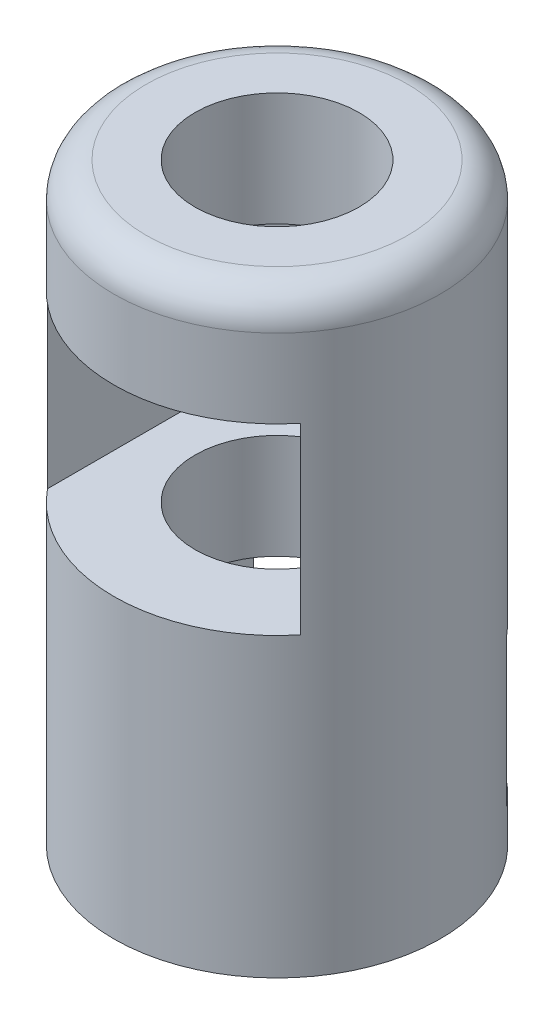
ISO-10303-21;
HEADER;
FILE_DESCRIPTION(('STEP AP214'),'2;1');
FILE_NAME('part.step','',(''),(''),'','','');
FILE_SCHEMA(('AUTOMOTIVE_DESIGN { 1 0 10303 214 1 1 1 1 }'));
ENDSEC;
DATA;
#1=APPLICATION_CONTEXT('core data for automotive mechanical design processes');
#2=APPLICATION_PROTOCOL_DEFINITION('international standard','automotive_design',2000,#1);
#3=PRODUCT_CONTEXT('',#1,'mechanical');
#4=PRODUCT('Part','Part','',(#3));
#5=PRODUCT_RELATED_PRODUCT_CATEGORY('part','',(#4));
#6=PRODUCT_DEFINITION_FORMATION('','',#4);
#7=PRODUCT_DEFINITION_CONTEXT('part definition',#1,'design');
#8=PRODUCT_DEFINITION('design','',#6,#7);
#9=PRODUCT_DEFINITION_SHAPE('','',#8);
#10=(LENGTH_UNIT() NAMED_UNIT(*) SI_UNIT(.MILLI.,.METRE.));
#11=(NAMED_UNIT(*) PLANE_ANGLE_UNIT() SI_UNIT($,.RADIAN.));
#12=(NAMED_UNIT(*) SI_UNIT($,.STERADIAN.) SOLID_ANGLE_UNIT());
#13=UNCERTAINTY_MEASURE_WITH_UNIT(LENGTH_MEASURE(1.E-05),#10,'distance_accuracy_value','');
#14=(GEOMETRIC_REPRESENTATION_CONTEXT(3) GLOBAL_UNCERTAINTY_ASSIGNED_CONTEXT((#13)) GLOBAL_UNIT_ASSIGNED_CONTEXT((#10,
#11,#12)) REPRESENTATION_CONTEXT('',''));
#15=CARTESIAN_POINT('',(0.,0.,0.));
#16=DIRECTION('',(0.,0.,1.));
#17=DIRECTION('',(1.,0.,0.));
#18=AXIS2_PLACEMENT_3D('',#15,#16,#17);
#19=CARTESIAN_POINT('',(0.,40.,0.));
#20=DIRECTION('',(0.,-1.,0.));
#21=DIRECTION('',(0.,0.,-1.));
#22=AXIS2_PLACEMENT_3D('',#19,#20,#21);
#23=CYLINDRICAL_SURFACE('',#22,4.7);
#24=CARTESIAN_POINT('',(0.,11.,0.));
#25=DIRECTION('',(0.,1.,0.));
#26=DIRECTION('',(0.,0.,1.));
#27=AXIS2_PLACEMENT_3D('',#24,#25,#26);
#28=CIRCLE('',#27,4.7);
#29=CARTESIAN_POINT('',(0.,11.,4.7));
#30=VERTEX_POINT('',#29);
#31=EDGE_CURVE('E191',#30,#30,#28,.F.);
#32=ORIENTED_EDGE('',*,*,#31,.T.);
#33=EDGE_LOOP('',(#32));
#34=FACE_BOUND('',#33,.T.);
#35=CARTESIAN_POINT('',(0.,17.,0.));
#36=DIRECTION('',(0.,1.,0.));
#37=DIRECTION('',(0.,0.,1.));
#38=AXIS2_PLACEMENT_3D('',#35,#36,#37);
#39=CIRCLE('',#38,4.7);
#40=CARTESIAN_POINT('',(0.,17.,4.7));
#41=VERTEX_POINT('',#40);
#42=EDGE_CURVE('E122',#41,#41,#39,.F.);
#43=ORIENTED_EDGE('',*,*,#42,.F.);
#44=EDGE_LOOP('',(#43));
#45=FACE_BOUND('',#44,.T.);
#46=ADVANCED_FACE('F34',(#34,#45),#23,.F.);
#47=CARTESIAN_POINT('',(0.,0.,0.));
#48=DIRECTION('',(0.,-1.,0.));
#49=DIRECTION('',(0.,0.,-1.));
#50=AXIS2_PLACEMENT_3D('',#47,#48,#49);
#51=CIRCLE('',#50,4.7);
#52=CARTESIAN_POINT('',(0.,0.,-4.7));
#53=VERTEX_POINT('',#52);
#54=EDGE_CURVE('E195',#53,#53,#51,.T.);
#55=ORIENTED_EDGE('',*,*,#54,.T.);
#56=EDGE_LOOP('',(#55));
#57=FACE_BOUND('',#56,.T.);
#58=CARTESIAN_POINT('',(0.,2.5,0.));
#59=DIRECTION('',(0.,1.,0.));
#60=DIRECTION('',(0.,0.,1.));
#61=AXIS2_PLACEMENT_3D('',#58,#59,#60);
#62=CIRCLE('',#61,4.7);
#63=CARTESIAN_POINT('',(0.,2.5,4.7));
#64=VERTEX_POINT('',#63);
#65=EDGE_CURVE('E199',#64,#64,#62,.F.);
#66=ORIENTED_EDGE('',*,*,#65,.F.);
#67=EDGE_LOOP('',(#66));
#68=FACE_BOUND('',#67,.T.);
#69=ADVANCED_FACE('F242',(#57,#68),#23,.F.);
#70=CARTESIAN_POINT('',(0.,0.,0.));
#71=DIRECTION('',(0.,1.,0.));
#72=DIRECTION('',(0.,0.,1.));
#73=AXIS2_PLACEMENT_3D('',#70,#71,#72);
#74=PLANE('',#73);
#75=ORIENTED_EDGE('',*,*,#54,.F.);
#76=EDGE_LOOP('',(#75));
#77=FACE_BOUND('',#76,.T.);
#78=CARTESIAN_POINT('',(0.,0.,0.));
#79=DIRECTION('',(0.,1.,0.));
#80=DIRECTION('',(0.,0.,1.));
#81=AXIS2_PLACEMENT_3D('',#78,#79,#80);
#82=CIRCLE('',#81,9.35);
#83=CARTESIAN_POINT('',(0.,0.,9.35));
#84=VERTEX_POINT('',#83);
#85=EDGE_CURVE('E203',#84,#84,#82,.T.);
#86=ORIENTED_EDGE('',*,*,#85,.F.);
#87=EDGE_LOOP('',(#86));
#88=FACE_BOUND('',#87,.T.);
#89=ADVANCED_FACE('F249',(#77,#88),#74,.F.);
#90=CARTESIAN_POINT('',(0.,34.,0.));
#91=DIRECTION('',(0.,-1.,0.));
#92=DIRECTION('',(0.,0.,-1.));
#93=AXIS2_PLACEMENT_3D('',#90,#91,#92);
#94=CYLINDRICAL_SURFACE('',#93,9.35);
#95=DIRECTION('',(0.,-1.,0.));
#96=VECTOR('',#95,1.);
#97=CARTESIAN_POINT('',(-7.25,34.,5.9042357676502));
#98=LINE('',#97,#96);
#99=CARTESIAN_POINT('',(-7.25,27.5,5.9042357676502));
#100=VERTEX_POINT('',#99);
#101=CARTESIAN_POINT('',(-7.25,17.,5.9042357676502));
#102=VERTEX_POINT('',#101);
#103=EDGE_CURVE('E11',#100,#102,#98,.T.);
#104=ORIENTED_EDGE('',*,*,#103,.F.);
#105=CARTESIAN_POINT('',(0.,27.5,0.));
#106=DIRECTION('',(0.,1.,0.));
#107=DIRECTION('',(0.,0.,1.));
#108=AXIS2_PLACEMENT_3D('',#105,#106,#107);
#109=CIRCLE('',#108,9.35);
#110=CARTESIAN_POINT('',(7.25,27.5,5.90423576765021));
#111=VERTEX_POINT('',#110);
#112=EDGE_CURVE('E155',#100,#111,#109,.T.);
#113=ORIENTED_EDGE('',*,*,#112,.T.);
#114=DIRECTION('',(0.,-1.,0.));
#115=VECTOR('',#114,1.);
#116=CARTESIAN_POINT('',(7.25,34.,5.90423576765021));
#117=LINE('',#116,#115);
#118=CARTESIAN_POINT('',(7.25,17.,5.90423576765021));
#119=VERTEX_POINT('',#118);
#120=EDGE_CURVE('E42',#111,#119,#117,.T.);
#121=ORIENTED_EDGE('',*,*,#120,.T.);
#122=CARTESIAN_POINT('',(0.,17.,0.));
#123=DIRECTION('',(0.,1.,0.));
#124=DIRECTION('',(0.,0.,1.));
#125=AXIS2_PLACEMENT_3D('',#122,#123,#124);
#126=CIRCLE('',#125,9.35);
#127=EDGE_CURVE('E152',#102,#119,#126,.T.);
#128=ORIENTED_EDGE('',*,*,#127,.F.);
#129=EDGE_LOOP('',(#104,#113,#121,#128));
#130=FACE_BOUND('',#129,.T.);
#131=CARTESIAN_POINT('',(0.,11.,0.));
#132=DIRECTION('',(0.,1.,0.));
#133=DIRECTION('',(-1.,0.,0.));
#134=AXIS2_PLACEMENT_3D('',#131,#132,#133);
#135=CIRCLE('',#134,9.35);
#136=CARTESIAN_POINT('',(7.25,11.,-5.9042357676502));
#137=VERTEX_POINT('',#136);
#138=CARTESIAN_POINT('',(-7.25,11.,-5.9042357676502));
#139=VERTEX_POINT('',#138);
#140=EDGE_CURVE('E160',#137,#139,#135,.T.);
#141=ORIENTED_EDGE('',*,*,#140,.T.);
#142=DIRECTION('',(0.,-1.,0.));
#143=VECTOR('',#142,1.);
#144=CARTESIAN_POINT('',(-7.25,34.,-5.9042357676502));
#145=LINE('',#144,#143);
#146=CARTESIAN_POINT('',(-7.25,2.5,-5.9042357676502));
#147=VERTEX_POINT('',#146);
#148=EDGE_CURVE('E166',#139,#147,#145,.T.);
#149=ORIENTED_EDGE('',*,*,#148,.T.);
#150=CARTESIAN_POINT('',(0.,2.5,0.));
#151=DIRECTION('',(0.,-1.,0.));
#152=DIRECTION('',(1.,0.,0.));
#153=AXIS2_PLACEMENT_3D('',#150,#151,#152);
#154=CIRCLE('',#153,9.35);
#155=CARTESIAN_POINT('',(7.25,2.5,-5.9042357676502));
#156=VERTEX_POINT('',#155);
#157=EDGE_CURVE('E157',#147,#156,#154,.T.);
#158=ORIENTED_EDGE('',*,*,#157,.T.);
#159=DIRECTION('',(0.,-1.,0.));
#160=VECTOR('',#159,1.);
#161=CARTESIAN_POINT('',(7.25,34.,-5.9042357676502));
#162=LINE('',#161,#160);
#163=EDGE_CURVE('E163',#156,#137,#162,.F.);
#164=ORIENTED_EDGE('',*,*,#163,.T.);
#165=EDGE_LOOP('',(#141,#149,#158,#164));
#166=FACE_BOUND('',#165,.T.);
#167=CARTESIAN_POINT('',(0.,32.0056329324821,0.));
#168=DIRECTION('',(0.,1.,0.));
#169=DIRECTION('',(0.,0.,1.));
#170=AXIS2_PLACEMENT_3D('',#167,#168,#169);
#171=CIRCLE('',#170,9.35);
#172=CARTESIAN_POINT('',(0.,32.0056329324821,9.35));
#173=VERTEX_POINT('',#172);
#174=EDGE_CURVE('E206',#173,#173,#171,.F.);
#175=ORIENTED_EDGE('',*,*,#174,.T.);
#176=EDGE_LOOP('',(#175));
#177=FACE_BOUND('',#176,.T.);
#178=ORIENTED_EDGE('',*,*,#85,.T.);
#179=EDGE_LOOP('',(#178));
#180=FACE_BOUND('',#179,.T.);
#181=ADVANCED_FACE('F221',(#130,#166,#177,#180),#94,.T.);
#182=CARTESIAN_POINT('',(0.,32.0056329324821,0.));
#183=DIRECTION('',(0.,1.,0.));
#184=DIRECTION('',(0.,0.,1.));
#185=AXIS2_PLACEMENT_3D('',#182,#183,#184);
#186=TOROIDAL_SURFACE('',#185,7.35,2.);
#187=ORIENTED_EDGE('',*,*,#174,.F.);
#188=EDGE_LOOP('',(#187));
#189=FACE_BOUND('',#188,.T.);
#190=CARTESIAN_POINT('',(0.,34.,0.));
#191=DIRECTION('',(0.,1.,0.));
#192=DIRECTION('',(0.,0.,1.));
#193=AXIS2_PLACEMENT_3D('',#190,#191,#192);
#194=CIRCLE('',#193,7.5);
#195=CARTESIAN_POINT('',(0.,34.,7.5));
#196=VERTEX_POINT('',#195);
#197=EDGE_CURVE('E200',#196,#196,#194,.T.);
#198=ORIENTED_EDGE('',*,*,#197,.F.);
#199=EDGE_LOOP('',(#198));
#200=FACE_BOUND('',#199,.T.);
#201=ADVANCED_FACE('F36',(#189,#200),#186,.T.);
#202=CARTESIAN_POINT('',(0.,34.,0.));
#203=DIRECTION('',(0.,-1.,0.));
#204=DIRECTION('',(0.,0.,-1.));
#205=AXIS2_PLACEMENT_3D('',#202,#203,#204);
#206=PLANE('',#205);
#207=CARTESIAN_POINT('',(0.,34.,0.));
#208=DIRECTION('',(0.,-1.,0.));
#209=DIRECTION('',(0.,0.,-1.));
#210=AXIS2_PLACEMENT_3D('',#207,#208,#209);
#211=CIRCLE('',#210,4.7);
#212=CARTESIAN_POINT('',(0.,34.,-4.7));
#213=VERTEX_POINT('',#212);
#214=EDGE_CURVE('E198',#213,#213,#211,.T.);
#215=ORIENTED_EDGE('',*,*,#214,.T.);
#216=EDGE_LOOP('',(#215));
#217=FACE_BOUND('',#216,.T.);
#218=ORIENTED_EDGE('',*,*,#197,.T.);
#219=EDGE_LOOP('',(#218));
#220=FACE_BOUND('',#219,.T.);
#221=ADVANCED_FACE('F256',(#217,#220),#206,.F.);
#222=CARTESIAN_POINT('',(0.,27.5,0.));
#223=DIRECTION('',(0.,1.,0.));
#224=DIRECTION('',(0.,0.,1.));
#225=AXIS2_PLACEMENT_3D('',#222,#223,#224);
#226=CIRCLE('',#225,4.7);
#227=CARTESIAN_POINT('',(0.,27.5,4.7));
#228=VERTEX_POINT('',#227);
#229=EDGE_CURVE('E154',#228,#228,#226,.F.);
#230=ORIENTED_EDGE('',*,*,#229,.T.);
#231=EDGE_LOOP('',(#230));
#232=FACE_BOUND('',#231,.T.);
#233=ORIENTED_EDGE('',*,*,#214,.F.);
#234=EDGE_LOOP('',(#233));
#235=FACE_BOUND('',#234,.T.);
#236=ADVANCED_FACE('F245',(#232,#235),#23,.F.);
#237=CARTESIAN_POINT('',(0.,2.5,0.));
#238=DIRECTION('',(0.,1.,0.));
#239=DIRECTION('',(0.,0.,1.));
#240=AXIS2_PLACEMENT_3D('',#237,#238,#239);
#241=PLANE('',#240);
#242=ORIENTED_EDGE('',*,*,#65,.T.);
#243=EDGE_LOOP('',(#242));
#244=FACE_BOUND('',#243,.T.);
#245=DIRECTION('',(0.,0.,1.));
#246=VECTOR('',#245,1.);
#247=CARTESIAN_POINT('',(-7.25,2.5,-4.18578945162479));
#248=LINE('',#247,#246);
#249=CARTESIAN_POINT('',(-7.25,2.5,4.18578945162479));
#250=VERTEX_POINT('',#249);
#251=EDGE_CURVE('E177',#147,#250,#248,.T.);
#252=ORIENTED_EDGE('',*,*,#251,.T.);
#253=DIRECTION('',(0.866025403784438,0.,0.5));
#254=VECTOR('',#253,1.);
#255=CARTESIAN_POINT('',(-7.25,2.5,4.18578945162479));
#256=LINE('',#255,#254);
#257=CARTESIAN_POINT('',(0.,2.5,8.37157890324958));
#258=VERTEX_POINT('',#257);
#259=EDGE_CURVE('E170',#250,#258,#256,.T.);
#260=ORIENTED_EDGE('',*,*,#259,.T.);
#261=DIRECTION('',(0.866025403784438,0.,-0.5));
#262=VECTOR('',#261,1.);
#263=CARTESIAN_POINT('',(0.,2.5,8.37157890324958));
#264=LINE('',#263,#262);
#265=CARTESIAN_POINT('',(7.25,2.5,4.18578945162479));
#266=VERTEX_POINT('',#265);
#267=EDGE_CURVE('E173',#258,#266,#264,.T.);
#268=ORIENTED_EDGE('',*,*,#267,.T.);
#269=DIRECTION('',(0.,0.,-1.));
#270=VECTOR('',#269,1.);
#271=CARTESIAN_POINT('',(7.25,2.5,4.18578945162479));
#272=LINE('',#271,#270);
#273=EDGE_CURVE('E56',#266,#156,#272,.T.);
#274=ORIENTED_EDGE('',*,*,#273,.T.);
#275=ORIENTED_EDGE('',*,*,#157,.F.);
#276=EDGE_LOOP('',(#252,#260,#268,#274,#275));
#277=FACE_BOUND('',#276,.T.);
#278=ADVANCED_FACE('F255',(#244,#277),#241,.T.);
#279=CARTESIAN_POINT('',(0.,11.,0.));
#280=DIRECTION('',(0.,1.,0.));
#281=DIRECTION('',(0.,0.,1.));
#282=AXIS2_PLACEMENT_3D('',#279,#280,#281);
#283=PLANE('',#282);
#284=ORIENTED_EDGE('',*,*,#31,.F.);
#285=EDGE_LOOP('',(#284));
#286=FACE_BOUND('',#285,.T.);
#287=DIRECTION('',(0.866025403784438,0.,0.5));
#288=VECTOR('',#287,1.);
#289=CARTESIAN_POINT('',(-7.25,11.,4.18578945162479));
#290=LINE('',#289,#288);
#291=CARTESIAN_POINT('',(-7.25,11.,4.18578945162479));
#292=VERTEX_POINT('',#291);
#293=CARTESIAN_POINT('',(0.,11.,8.37157890324958));
#294=VERTEX_POINT('',#293);
#295=EDGE_CURVE('E169',#292,#294,#290,.T.);
#296=ORIENTED_EDGE('',*,*,#295,.F.);
#297=DIRECTION('',(0.,0.,1.));
#298=VECTOR('',#297,1.);
#299=CARTESIAN_POINT('',(-7.25,11.,-4.18578945162479));
#300=LINE('',#299,#298);
#301=EDGE_CURVE('E174',#139,#292,#300,.T.);
#302=ORIENTED_EDGE('',*,*,#301,.F.);
#303=ORIENTED_EDGE('',*,*,#140,.F.);
#304=DIRECTION('',(0.,0.,-1.));
#305=VECTOR('',#304,1.);
#306=CARTESIAN_POINT('',(7.25,11.,4.18578945162479));
#307=LINE('',#306,#305);
#308=CARTESIAN_POINT('',(7.25,11.,4.18578945162479));
#309=VERTEX_POINT('',#308);
#310=EDGE_CURVE('E185',#309,#137,#307,.T.);
#311=ORIENTED_EDGE('',*,*,#310,.F.);
#312=DIRECTION('',(0.866025403784438,0.,-0.5));
#313=VECTOR('',#312,1.);
#314=CARTESIAN_POINT('',(0.,11.,8.37157890324958));
#315=LINE('',#314,#313);
#316=EDGE_CURVE('E182',#294,#309,#315,.T.);
#317=ORIENTED_EDGE('',*,*,#316,.F.);
#318=EDGE_LOOP('',(#296,#302,#303,#311,#317));
#319=FACE_BOUND('',#318,.T.);
#320=ADVANCED_FACE('F262',(#286,#319),#283,.F.);
#321=CARTESIAN_POINT('',(-7.25,2.5,4.18578945162479));
#322=DIRECTION('',(-0.5,0.,0.866025403784439));
#323=DIRECTION('',(0.866025403784439,0.,0.5));
#324=AXIS2_PLACEMENT_3D('',#321,#322,#323);
#325=PLANE('',#324);
#326=ORIENTED_EDGE('',*,*,#295,.T.);
#327=DIRECTION('',(0.,1.,0.));
#328=VECTOR('',#327,1.);
#329=CARTESIAN_POINT('',(0.,2.5,8.37157890324958));
#330=LINE('',#329,#328);
#331=EDGE_CURVE('E179',#258,#294,#330,.T.);
#332=ORIENTED_EDGE('',*,*,#331,.F.);
#333=ORIENTED_EDGE('',*,*,#259,.F.);
#334=DIRECTION('',(0.,1.,0.));
#335=VECTOR('',#334,1.);
#336=CARTESIAN_POINT('',(-7.25,2.5,4.18578945162479));
#337=LINE('',#336,#335);
#338=EDGE_CURVE('E188',#250,#292,#337,.T.);
#339=ORIENTED_EDGE('',*,*,#338,.T.);
#340=EDGE_LOOP('',(#326,#332,#333,#339));
#341=FACE_BOUND('',#340,.T.);
#342=ADVANCED_FACE('F297',(#341),#325,.F.);
#343=CARTESIAN_POINT('',(-7.25,2.5,-4.18578945162479));
#344=DIRECTION('',(-1.,0.,0.));
#345=DIRECTION('',(0.,0.,1.));
#346=AXIS2_PLACEMENT_3D('',#343,#344,#345);
#347=PLANE('',#346);
#348=ORIENTED_EDGE('',*,*,#338,.F.);
#349=ORIENTED_EDGE('',*,*,#251,.F.);
#350=ORIENTED_EDGE('',*,*,#148,.F.);
#351=ORIENTED_EDGE('',*,*,#301,.T.);
#352=EDGE_LOOP('',(#348,#349,#350,#351));
#353=FACE_BOUND('',#352,.T.);
#354=ADVANCED_FACE('F294',(#353),#347,.F.);
#355=CARTESIAN_POINT('',(7.25,2.5,4.18578945162479));
#356=DIRECTION('',(1.,0.,0.));
#357=DIRECTION('',(0.,0.,-1.));
#358=AXIS2_PLACEMENT_3D('',#355,#356,#357);
#359=PLANE('',#358);
#360=ORIENTED_EDGE('',*,*,#310,.T.);
#361=ORIENTED_EDGE('',*,*,#163,.F.);
#362=ORIENTED_EDGE('',*,*,#273,.F.);
#363=DIRECTION('',(0.,1.,0.));
#364=VECTOR('',#363,1.);
#365=CARTESIAN_POINT('',(7.25,2.5,4.18578945162479));
#366=LINE('',#365,#364);
#367=EDGE_CURVE('E192',#266,#309,#366,.T.);
#368=ORIENTED_EDGE('',*,*,#367,.T.);
#369=EDGE_LOOP('',(#360,#361,#362,#368));
#370=FACE_BOUND('',#369,.T.);
#371=ADVANCED_FACE('F304',(#370),#359,.F.);
#372=CARTESIAN_POINT('',(0.,2.5,8.37157890324958));
#373=DIRECTION('',(0.5,0.,0.866025403784438));
#374=DIRECTION('',(0.866025403784438,0.,-0.5));
#375=AXIS2_PLACEMENT_3D('',#372,#373,#374);
#376=PLANE('',#375);
#377=ORIENTED_EDGE('',*,*,#316,.T.);
#378=ORIENTED_EDGE('',*,*,#367,.F.);
#379=ORIENTED_EDGE('',*,*,#267,.F.);
#380=ORIENTED_EDGE('',*,*,#331,.T.);
#381=EDGE_LOOP('',(#377,#378,#379,#380));
#382=FACE_BOUND('',#381,.T.);
#383=ADVANCED_FACE('F301',(#382),#376,.F.);
#384=CARTESIAN_POINT('',(-7.25,27.5,0.));
#385=DIRECTION('',(1.,0.,0.));
#386=DIRECTION('',(0.,0.,-1.));
#387=AXIS2_PLACEMENT_3D('',#384,#385,#386);
#388=PLANE('',#387);
#389=ORIENTED_EDGE('',*,*,#103,.T.);
#390=DIRECTION('',(0.,0.,1.));
#391=VECTOR('',#390,1.);
#392=CARTESIAN_POINT('',(-7.25,17.,0.));
#393=LINE('',#392,#391);
#394=CARTESIAN_POINT('',(-7.25,17.,-4.18578945162479));
#395=VERTEX_POINT('',#394);
#396=EDGE_CURVE('E49',#395,#102,#393,.T.);
#397=ORIENTED_EDGE('',*,*,#396,.F.);
#398=DIRECTION('',(0.,-1.,0.));
#399=VECTOR('',#398,1.);
#400=CARTESIAN_POINT('',(-7.25,27.5,-4.18578945162479));
#401=LINE('',#400,#399);
#402=CARTESIAN_POINT('',(-7.25,27.5,-4.18578945162479));
#403=VERTEX_POINT('',#402);
#404=EDGE_CURVE('E143',#403,#395,#401,.T.);
#405=ORIENTED_EDGE('',*,*,#404,.F.);
#406=DIRECTION('',(0.,0.,1.));
#407=VECTOR('',#406,1.);
#408=CARTESIAN_POINT('',(-7.25,27.5,0.));
#409=LINE('',#408,#407);
#410=EDGE_CURVE('E136',#403,#100,#409,.T.);
#411=ORIENTED_EDGE('',*,*,#410,.T.);
#412=EDGE_LOOP('',(#389,#397,#405,#411));
#413=FACE_BOUND('',#412,.T.);
#414=ADVANCED_FACE('F225',(#413),#388,.T.);
#415=CARTESIAN_POINT('',(7.25,27.5,0.));
#416=DIRECTION('',(1.,0.,0.));
#417=DIRECTION('',(0.,0.,-1.));
#418=AXIS2_PLACEMENT_3D('',#415,#416,#417);
#419=PLANE('',#418);
#420=DIRECTION('',(0.,0.,1.));
#421=VECTOR('',#420,1.);
#422=CARTESIAN_POINT('',(7.25,27.5,0.));
#423=LINE('',#422,#421);
#424=CARTESIAN_POINT('',(7.25,27.5,-4.18578945162479));
#425=VERTEX_POINT('',#424);
#426=EDGE_CURVE('E130',#425,#111,#423,.T.);
#427=ORIENTED_EDGE('',*,*,#426,.F.);
#428=DIRECTION('',(0.,-1.,0.));
#429=VECTOR('',#428,1.);
#430=CARTESIAN_POINT('',(7.25,27.5,-4.18578945162479));
#431=LINE('',#430,#429);
#432=CARTESIAN_POINT('',(7.25,17.,-4.18578945162479));
#433=VERTEX_POINT('',#432);
#434=EDGE_CURVE('E111',#425,#433,#431,.T.);
#435=ORIENTED_EDGE('',*,*,#434,.T.);
#436=DIRECTION('',(0.,0.,1.));
#437=VECTOR('',#436,1.);
#438=CARTESIAN_POINT('',(7.25,17.,0.));
#439=LINE('',#438,#437);
#440=EDGE_CURVE('E145',#433,#119,#439,.T.);
#441=ORIENTED_EDGE('',*,*,#440,.T.);
#442=ORIENTED_EDGE('',*,*,#120,.F.);
#443=EDGE_LOOP('',(#427,#435,#441,#442));
#444=FACE_BOUND('',#443,.T.);
#445=ADVANCED_FACE('F134',(#444),#419,.F.);
#446=CARTESIAN_POINT('',(0.,27.5,0.));
#447=DIRECTION('',(0.,1.,0.));
#448=DIRECTION('',(0.,0.,1.));
#449=AXIS2_PLACEMENT_3D('',#446,#447,#448);
#450=PLANE('',#449);
#451=ORIENTED_EDGE('',*,*,#229,.F.);
#452=EDGE_LOOP('',(#451));
#453=FACE_BOUND('',#452,.T.);
#454=ORIENTED_EDGE('',*,*,#410,.F.);
#455=DIRECTION('',(-0.866025403784439,0.,0.5));
#456=VECTOR('',#455,1.);
#457=CARTESIAN_POINT('',(-3.625,27.5,-6.27868417743718));
#458=LINE('',#457,#456);
#459=CARTESIAN_POINT('',(0.,27.5,-8.37157890324957));
#460=VERTEX_POINT('',#459);
#461=EDGE_CURVE('E132',#460,#403,#458,.T.);
#462=ORIENTED_EDGE('',*,*,#461,.F.);
#463=DIRECTION('',(-0.866025403784439,0.,-0.5));
#464=VECTOR('',#463,1.);
#465=CARTESIAN_POINT('',(3.625,27.5,-6.27868417743718));
#466=LINE('',#465,#464);
#467=EDGE_CURVE('E115',#425,#460,#466,.T.);
#468=ORIENTED_EDGE('',*,*,#467,.F.);
#469=ORIENTED_EDGE('',*,*,#426,.T.);
#470=ORIENTED_EDGE('',*,*,#112,.F.);
#471=EDGE_LOOP('',(#454,#462,#468,#469,#470));
#472=FACE_BOUND('',#471,.T.);
#473=ADVANCED_FACE('F129',(#453,#472),#450,.F.);
#474=CARTESIAN_POINT('',(0.,17.,0.));
#475=DIRECTION('',(0.,1.,0.));
#476=DIRECTION('',(0.,0.,1.));
#477=AXIS2_PLACEMENT_3D('',#474,#475,#476);
#478=PLANE('',#477);
#479=ORIENTED_EDGE('',*,*,#42,.T.);
#480=EDGE_LOOP('',(#479));
#481=FACE_BOUND('',#480,.T.);
#482=ORIENTED_EDGE('',*,*,#127,.T.);
#483=ORIENTED_EDGE('',*,*,#440,.F.);
#484=DIRECTION('',(-0.866025403784439,0.,-0.5));
#485=VECTOR('',#484,1.);
#486=CARTESIAN_POINT('',(3.625,17.,-6.27868417743718));
#487=LINE('',#486,#485);
#488=CARTESIAN_POINT('',(0.,17.,-8.37157890324957));
#489=VERTEX_POINT('',#488);
#490=EDGE_CURVE('E117',#433,#489,#487,.T.);
#491=ORIENTED_EDGE('',*,*,#490,.T.);
#492=DIRECTION('',(-0.866025403784439,0.,0.5));
#493=VECTOR('',#492,1.);
#494=CARTESIAN_POINT('',(-3.625,17.,-6.27868417743718));
#495=LINE('',#494,#493);
#496=EDGE_CURVE('E139',#489,#395,#495,.T.);
#497=ORIENTED_EDGE('',*,*,#496,.T.);
#498=ORIENTED_EDGE('',*,*,#396,.T.);
#499=EDGE_LOOP('',(#482,#483,#491,#497,#498));
#500=FACE_BOUND('',#499,.T.);
#501=ADVANCED_FACE('F229',(#481,#500),#478,.T.);
#502=CARTESIAN_POINT('',(3.625,27.5,-6.27868417743718));
#503=DIRECTION('',(-0.5,0.,0.866025403784439));
#504=DIRECTION('',(0.866025403784439,0.,0.5));
#505=AXIS2_PLACEMENT_3D('',#502,#503,#504);
#506=PLANE('',#505);
#507=ORIENTED_EDGE('',*,*,#490,.F.);
#508=ORIENTED_EDGE('',*,*,#434,.F.);
#509=ORIENTED_EDGE('',*,*,#467,.T.);
#510=DIRECTION('',(0.,-1.,0.));
#511=VECTOR('',#510,1.);
#512=CARTESIAN_POINT('',(0.,27.5,-8.37157890324957));
#513=LINE('',#512,#511);
#514=EDGE_CURVE('E123',#460,#489,#513,.T.);
#515=ORIENTED_EDGE('',*,*,#514,.T.);
#516=EDGE_LOOP('',(#507,#508,#509,#515));
#517=FACE_BOUND('',#516,.T.);
#518=ADVANCED_FACE('F113',(#517),#506,.T.);
#519=CARTESIAN_POINT('',(-3.625,27.5,-6.27868417743718));
#520=DIRECTION('',(0.5,0.,0.866025403784439));
#521=DIRECTION('',(0.866025403784439,0.,-0.5));
#522=AXIS2_PLACEMENT_3D('',#519,#520,#521);
#523=PLANE('',#522);
#524=ORIENTED_EDGE('',*,*,#496,.F.);
#525=ORIENTED_EDGE('',*,*,#514,.F.);
#526=ORIENTED_EDGE('',*,*,#461,.T.);
#527=ORIENTED_EDGE('',*,*,#404,.T.);
#528=EDGE_LOOP('',(#524,#525,#526,#527));
#529=FACE_BOUND('',#528,.T.);
#530=ADVANCED_FACE('F228',(#529),#523,.T.);
#531=CLOSED_SHELL('',(#46,#69,#89,#181,#201,#221,#236,#278,#320,#342,#354,#371,#383,#414,#445,
#473,#501,#518,#530));
#532=MANIFOLD_SOLID_BREP('B2',#531);
#533=ADVANCED_BREP_SHAPE_REPRESENTATION('',(#18,#532),#14);
#534=SHAPE_DEFINITION_REPRESENTATION(#9,#533);
ENDSEC;
END-ISO-10303-21;
